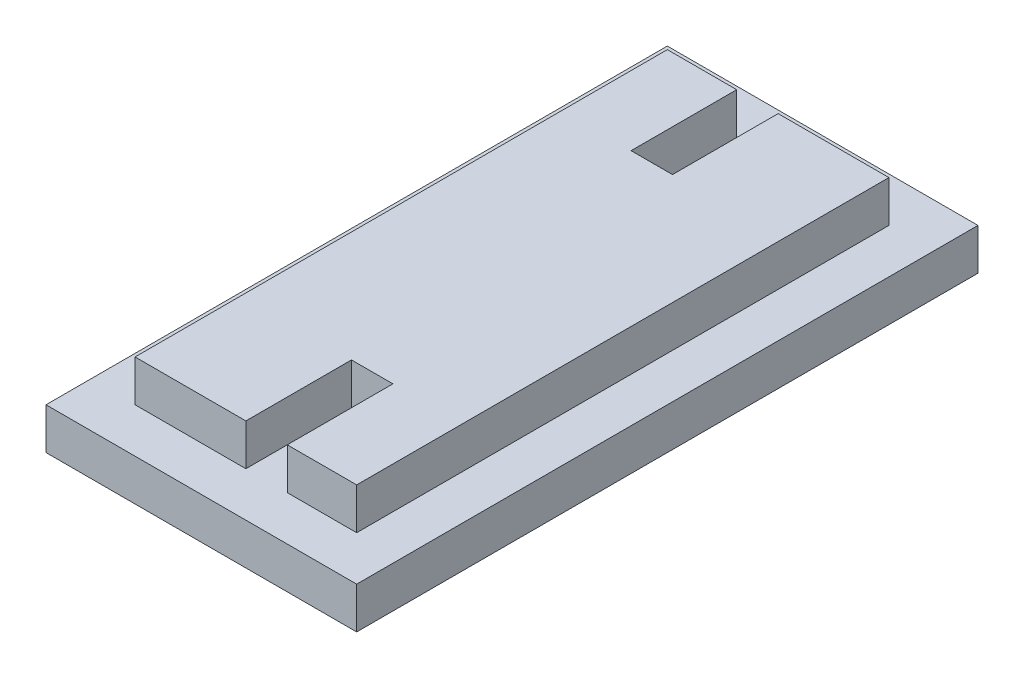
ISO-10303-21;
HEADER;
FILE_DESCRIPTION(('STEP AP214'),'2;1');
FILE_NAME('part.step','',(''),(''),'','','');
FILE_SCHEMA(('AUTOMOTIVE_DESIGN { 1 0 10303 214 1 1 1 1 }'));
ENDSEC;
DATA;
#1=APPLICATION_CONTEXT('core data for automotive mechanical design processes');
#2=APPLICATION_PROTOCOL_DEFINITION('international standard','automotive_design',2000,#1);
#3=PRODUCT_CONTEXT('',#1,'mechanical');
#4=PRODUCT('Part','Part','',(#3));
#5=PRODUCT_RELATED_PRODUCT_CATEGORY('part','',(#4));
#6=PRODUCT_DEFINITION_FORMATION('','',#4);
#7=PRODUCT_DEFINITION_CONTEXT('part definition',#1,'design');
#8=PRODUCT_DEFINITION('design','',#6,#7);
#9=PRODUCT_DEFINITION_SHAPE('','',#8);
#10=(LENGTH_UNIT() NAMED_UNIT(*) SI_UNIT(.MILLI.,.METRE.));
#11=(NAMED_UNIT(*) PLANE_ANGLE_UNIT() SI_UNIT($,.RADIAN.));
#12=(NAMED_UNIT(*) SI_UNIT($,.STERADIAN.) SOLID_ANGLE_UNIT());
#13=UNCERTAINTY_MEASURE_WITH_UNIT(LENGTH_MEASURE(1.E-05),#10,'distance_accuracy_value','');
#14=(GEOMETRIC_REPRESENTATION_CONTEXT(3) GLOBAL_UNCERTAINTY_ASSIGNED_CONTEXT((#13)) GLOBAL_UNIT_ASSIGNED_CONTEXT((#10,
#11,#12)) REPRESENTATION_CONTEXT('',''));
#15=CARTESIAN_POINT('',(0.,0.,0.));
#16=DIRECTION('',(0.,0.,1.));
#17=DIRECTION('',(1.,0.,0.));
#18=AXIS2_PLACEMENT_3D('',#15,#16,#17);
#19=CARTESIAN_POINT('',(2.15,4.,-2.15));
#20=DIRECTION('',(0.,0.,-1.));
#21=DIRECTION('',(-1.,0.,0.));
#22=AXIS2_PLACEMENT_3D('',#19,#20,#21);
#23=PLANE('',#22);
#24=DIRECTION('',(1.,0.,0.));
#25=VECTOR('',#24,1.);
#26=CARTESIAN_POINT('',(2.15,2.,-2.15));
#27=LINE('',#26,#25);
#28=CARTESIAN_POINT('',(2.15,2.,-2.15));
#29=VERTEX_POINT('',#28);
#30=CARTESIAN_POINT('',(7.5,2.,-2.15));
#31=VERTEX_POINT('',#30);
#32=EDGE_CURVE('E165',#29,#31,#27,.T.);
#33=ORIENTED_EDGE('',*,*,#32,.T.);
#34=DIRECTION('',(0.,1.,0.));
#35=VECTOR('',#34,1.);
#36=CARTESIAN_POINT('',(7.5,2.,-2.15));
#37=LINE('',#36,#35);
#38=CARTESIAN_POINT('',(7.5,4.,-2.15));
#39=VERTEX_POINT('',#38);
#40=EDGE_CURVE('E150',#31,#39,#37,.T.);
#41=ORIENTED_EDGE('',*,*,#40,.T.);
#42=DIRECTION('',(1.,0.,0.));
#43=VECTOR('',#42,1.);
#44=CARTESIAN_POINT('',(2.15,4.,-2.15));
#45=LINE('',#44,#43);
#46=CARTESIAN_POINT('',(2.15,4.,-2.15));
#47=VERTEX_POINT('',#46);
#48=EDGE_CURVE('E278',#47,#39,#45,.T.);
#49=ORIENTED_EDGE('',*,*,#48,.F.);
#50=DIRECTION('',(0.,-1.,0.));
#51=VECTOR('',#50,1.);
#52=CARTESIAN_POINT('',(2.15,4.,-2.15));
#53=LINE('',#52,#51);
#54=EDGE_CURVE('E173',#47,#29,#53,.T.);
#55=ORIENTED_EDGE('',*,*,#54,.T.);
#56=EDGE_LOOP('',(#33,#41,#49,#55));
#57=FACE_BOUND('',#56,.T.);
#58=ADVANCED_FACE('F35',(#57),#23,.F.);
#59=CARTESIAN_POINT('',(2.15,4.,-27.85));
#60=DIRECTION('',(0.,0.,1.));
#61=DIRECTION('',(1.,0.,0.));
#62=AXIS2_PLACEMENT_3D('',#59,#60,#61);
#63=PLANE('',#62);
#64=DIRECTION('',(-1.,0.,0.));
#65=VECTOR('',#64,1.);
#66=CARTESIAN_POINT('',(2.15,2.,-27.85));
#67=LINE('',#66,#65);
#68=CARTESIAN_POINT('',(12.85,2.,-27.85));
#69=VERTEX_POINT('',#68);
#70=CARTESIAN_POINT('',(7.5,2.,-27.85));
#71=VERTEX_POINT('',#70);
#72=EDGE_CURVE('E185',#69,#71,#67,.T.);
#73=ORIENTED_EDGE('',*,*,#72,.T.);
#74=DIRECTION('',(0.,1.,0.));
#75=VECTOR('',#74,1.);
#76=CARTESIAN_POINT('',(7.5,2.,-27.85));
#77=LINE('',#76,#75);
#78=CARTESIAN_POINT('',(7.5,4.,-27.85));
#79=VERTEX_POINT('',#78);
#80=EDGE_CURVE('E308',#71,#79,#77,.T.);
#81=ORIENTED_EDGE('',*,*,#80,.T.);
#82=DIRECTION('',(-1.,0.,0.));
#83=VECTOR('',#82,1.);
#84=CARTESIAN_POINT('',(2.15,4.,-27.85));
#85=LINE('',#84,#83);
#86=CARTESIAN_POINT('',(12.85,4.,-27.85));
#87=VERTEX_POINT('',#86);
#88=EDGE_CURVE('E193',#87,#79,#85,.T.);
#89=ORIENTED_EDGE('',*,*,#88,.F.);
#90=DIRECTION('',(0.,-1.,0.));
#91=VECTOR('',#90,1.);
#92=CARTESIAN_POINT('',(12.85,4.,-27.85));
#93=LINE('',#92,#91);
#94=EDGE_CURVE('E192',#87,#69,#93,.T.);
#95=ORIENTED_EDGE('',*,*,#94,.T.);
#96=EDGE_LOOP('',(#73,#81,#89,#95));
#97=FACE_BOUND('',#96,.T.);
#98=ADVANCED_FACE('F251',(#97),#63,.F.);
#99=CARTESIAN_POINT('',(0.,2.,0.));
#100=DIRECTION('',(0.,-1.,0.));
#101=DIRECTION('',(0.,0.,-1.));
#102=AXIS2_PLACEMENT_3D('',#99,#100,#101);
#103=PLANE('',#102);
#104=DIRECTION('',(0.,0.,1.));
#105=VECTOR('',#104,1.);
#106=CARTESIAN_POINT('',(0.,2.,0.));
#107=LINE('',#106,#105);
#108=CARTESIAN_POINT('',(0.,2.,-30.));
#109=VERTEX_POINT('',#108);
#110=CARTESIAN_POINT('',(0.,2.,0.));
#111=VERTEX_POINT('',#110);
#112=EDGE_CURVE('E201',#109,#111,#107,.T.);
#113=ORIENTED_EDGE('',*,*,#112,.T.);
#114=DIRECTION('',(1.,0.,0.));
#115=VECTOR('',#114,1.);
#116=CARTESIAN_POINT('',(0.,2.,0.));
#117=LINE('',#116,#115);
#118=CARTESIAN_POINT('',(15.,2.,0.));
#119=VERTEX_POINT('',#118);
#120=EDGE_CURVE('E204',#111,#119,#117,.T.);
#121=ORIENTED_EDGE('',*,*,#120,.T.);
#122=DIRECTION('',(0.,0.,-1.));
#123=VECTOR('',#122,1.);
#124=CARTESIAN_POINT('',(15.,2.,0.));
#125=LINE('',#124,#123);
#126=CARTESIAN_POINT('',(15.,2.,-30.));
#127=VERTEX_POINT('',#126);
#128=EDGE_CURVE('E207',#119,#127,#125,.T.);
#129=ORIENTED_EDGE('',*,*,#128,.T.);
#130=DIRECTION('',(-1.,0.,0.));
#131=VECTOR('',#130,1.);
#132=CARTESIAN_POINT('',(0.,2.,-30.));
#133=LINE('',#132,#131);
#134=EDGE_CURVE('E209',#127,#109,#133,.T.);
#135=ORIENTED_EDGE('',*,*,#134,.T.);
#136=EDGE_LOOP('',(#113,#121,#129,#135));
#137=FACE_BOUND('',#136,.T.);
#138=DIRECTION('',(0.,0.,1.));
#139=VECTOR('',#138,1.);
#140=CARTESIAN_POINT('',(2.15,2.,-27.85));
#141=LINE('',#140,#139);
#142=CARTESIAN_POINT('',(2.15,2.,-27.85));
#143=VERTEX_POINT('',#142);
#144=EDGE_CURVE('E181',#143,#29,#141,.T.);
#145=ORIENTED_EDGE('',*,*,#144,.F.);
#146=CARTESIAN_POINT('',(5.5,2.,-27.85));
#147=VERTEX_POINT('',#146);
#148=EDGE_CURVE('E179',#147,#143,#67,.T.);
#149=ORIENTED_EDGE('',*,*,#148,.F.);
#150=DIRECTION('',(0.,0.,1.));
#151=VECTOR('',#150,1.);
#152=CARTESIAN_POINT('',(5.5,2.,-27.85));
#153=LINE('',#152,#151);
#154=CARTESIAN_POINT('',(5.5,2.,-22.75));
#155=VERTEX_POINT('',#154);
#156=EDGE_CURVE('E312',#147,#155,#153,.T.);
#157=ORIENTED_EDGE('',*,*,#156,.T.);
#158=DIRECTION('',(1.,0.,0.));
#159=VECTOR('',#158,1.);
#160=CARTESIAN_POINT('',(7.5,2.,-22.75));
#161=LINE('',#160,#159);
#162=CARTESIAN_POINT('',(7.5,2.,-22.75));
#163=VERTEX_POINT('',#162);
#164=EDGE_CURVE('E310',#155,#163,#161,.T.);
#165=ORIENTED_EDGE('',*,*,#164,.T.);
#166=DIRECTION('',(0.,0.,-1.));
#167=VECTOR('',#166,1.);
#168=CARTESIAN_POINT('',(7.5,2.,-27.85));
#169=LINE('',#168,#167);
#170=EDGE_CURVE('E317',#163,#71,#169,.T.);
#171=ORIENTED_EDGE('',*,*,#170,.T.);
#172=ORIENTED_EDGE('',*,*,#72,.F.);
#173=DIRECTION('',(0.,0.,-1.));
#174=VECTOR('',#173,1.);
#175=CARTESIAN_POINT('',(12.85,2.,-27.85));
#176=LINE('',#175,#174);
#177=CARTESIAN_POINT('',(12.85,2.,-2.15));
#178=VERTEX_POINT('',#177);
#179=EDGE_CURVE('E175',#178,#69,#176,.T.);
#180=ORIENTED_EDGE('',*,*,#179,.F.);
#181=CARTESIAN_POINT('',(9.5,2.,-2.15));
#182=VERTEX_POINT('',#181);
#183=EDGE_CURVE('E176',#182,#178,#27,.T.);
#184=ORIENTED_EDGE('',*,*,#183,.F.);
#185=DIRECTION('',(0.,0.,-1.));
#186=VECTOR('',#185,1.);
#187=CARTESIAN_POINT('',(9.5,2.,-2.15));
#188=LINE('',#187,#186);
#189=CARTESIAN_POINT('',(9.5,2.,-7.25));
#190=VERTEX_POINT('',#189);
#191=EDGE_CURVE('E169',#182,#190,#188,.T.);
#192=ORIENTED_EDGE('',*,*,#191,.T.);
#193=DIRECTION('',(-1.,0.,0.));
#194=VECTOR('',#193,1.);
#195=CARTESIAN_POINT('',(7.5,2.,-7.25));
#196=LINE('',#195,#194);
#197=CARTESIAN_POINT('',(7.5,2.,-7.25));
#198=VERTEX_POINT('',#197);
#199=EDGE_CURVE('E160',#190,#198,#196,.T.);
#200=ORIENTED_EDGE('',*,*,#199,.T.);
#201=DIRECTION('',(0.,0.,1.));
#202=VECTOR('',#201,1.);
#203=CARTESIAN_POINT('',(7.5,2.,-2.15));
#204=LINE('',#203,#202);
#205=EDGE_CURVE('E153',#198,#31,#204,.T.);
#206=ORIENTED_EDGE('',*,*,#205,.T.);
#207=ORIENTED_EDGE('',*,*,#32,.F.);
#208=EDGE_LOOP('',(#145,#149,#157,#165,#171,#172,#180,#184,#192,#200,#206,#207));
#209=FACE_BOUND('',#208,.T.);
#210=ADVANCED_FACE('F164',(#137,#209),#103,.F.);
#211=CARTESIAN_POINT('',(0.,2.,0.));
#212=DIRECTION('',(1.,0.,0.));
#213=DIRECTION('',(0.,0.,-1.));
#214=AXIS2_PLACEMENT_3D('',#211,#212,#213);
#215=PLANE('',#214);
#216=DIRECTION('',(0.,0.,1.));
#217=VECTOR('',#216,1.);
#218=CARTESIAN_POINT('',(0.,0.,0.));
#219=LINE('',#218,#217);
#220=CARTESIAN_POINT('',(0.,0.,-30.));
#221=VERTEX_POINT('',#220);
#222=CARTESIAN_POINT('',(0.,0.,0.));
#223=VERTEX_POINT('',#222);
#224=EDGE_CURVE('E200',#221,#223,#219,.T.);
#225=ORIENTED_EDGE('',*,*,#224,.T.);
#226=DIRECTION('',(0.,-1.,0.));
#227=VECTOR('',#226,1.);
#228=CARTESIAN_POINT('',(0.,2.,0.));
#229=LINE('',#228,#227);
#230=EDGE_CURVE('E11',#111,#223,#229,.T.);
#231=ORIENTED_EDGE('',*,*,#230,.F.);
#232=ORIENTED_EDGE('',*,*,#112,.F.);
#233=DIRECTION('',(0.,-1.,0.));
#234=VECTOR('',#233,1.);
#235=CARTESIAN_POINT('',(0.,2.,-30.));
#236=LINE('',#235,#234);
#237=EDGE_CURVE('E211',#109,#221,#236,.T.);
#238=ORIENTED_EDGE('',*,*,#237,.T.);
#239=EDGE_LOOP('',(#225,#231,#232,#238));
#240=FACE_BOUND('',#239,.T.);
#241=ADVANCED_FACE('F37',(#240),#215,.F.);
#242=CARTESIAN_POINT('',(0.,2.,0.));
#243=DIRECTION('',(0.,0.,-1.));
#244=DIRECTION('',(-1.,0.,0.));
#245=AXIS2_PLACEMENT_3D('',#242,#243,#244);
#246=PLANE('',#245);
#247=DIRECTION('',(1.,0.,0.));
#248=VECTOR('',#247,1.);
#249=CARTESIAN_POINT('',(0.,0.,0.));
#250=LINE('',#249,#248);
#251=CARTESIAN_POINT('',(15.,0.,0.));
#252=VERTEX_POINT('',#251);
#253=EDGE_CURVE('E214',#223,#252,#250,.T.);
#254=ORIENTED_EDGE('',*,*,#253,.T.);
#255=DIRECTION('',(0.,-1.,0.));
#256=VECTOR('',#255,1.);
#257=CARTESIAN_POINT('',(15.,2.,0.));
#258=LINE('',#257,#256);
#259=EDGE_CURVE('E43',#119,#252,#258,.T.);
#260=ORIENTED_EDGE('',*,*,#259,.F.);
#261=ORIENTED_EDGE('',*,*,#120,.F.);
#262=ORIENTED_EDGE('',*,*,#230,.T.);
#263=EDGE_LOOP('',(#254,#260,#261,#262));
#264=FACE_BOUND('',#263,.T.);
#265=ADVANCED_FACE('F243',(#264),#246,.F.);
#266=CARTESIAN_POINT('',(15.,2.,0.));
#267=DIRECTION('',(-1.,0.,0.));
#268=DIRECTION('',(0.,0.,1.));
#269=AXIS2_PLACEMENT_3D('',#266,#267,#268);
#270=PLANE('',#269);
#271=DIRECTION('',(0.,0.,-1.));
#272=VECTOR('',#271,1.);
#273=CARTESIAN_POINT('',(15.,0.,0.));
#274=LINE('',#273,#272);
#275=CARTESIAN_POINT('',(15.,0.,-30.));
#276=VERTEX_POINT('',#275);
#277=EDGE_CURVE('E216',#252,#276,#274,.T.);
#278=ORIENTED_EDGE('',*,*,#277,.T.);
#279=DIRECTION('',(0.,-1.,0.));
#280=VECTOR('',#279,1.);
#281=CARTESIAN_POINT('',(15.,2.,-30.));
#282=LINE('',#281,#280);
#283=EDGE_CURVE('E221',#127,#276,#282,.T.);
#284=ORIENTED_EDGE('',*,*,#283,.F.);
#285=ORIENTED_EDGE('',*,*,#128,.F.);
#286=ORIENTED_EDGE('',*,*,#259,.T.);
#287=EDGE_LOOP('',(#278,#284,#285,#286));
#288=FACE_BOUND('',#287,.T.);
#289=ADVANCED_FACE('F228',(#288),#270,.F.);
#290=CARTESIAN_POINT('',(0.,2.,-30.));
#291=DIRECTION('',(0.,0.,1.));
#292=DIRECTION('',(1.,0.,0.));
#293=AXIS2_PLACEMENT_3D('',#290,#291,#292);
#294=PLANE('',#293);
#295=DIRECTION('',(-1.,0.,0.));
#296=VECTOR('',#295,1.);
#297=CARTESIAN_POINT('',(0.,0.,-30.));
#298=LINE('',#297,#296);
#299=EDGE_CURVE('E205',#276,#221,#298,.T.);
#300=ORIENTED_EDGE('',*,*,#299,.T.);
#301=ORIENTED_EDGE('',*,*,#237,.F.);
#302=ORIENTED_EDGE('',*,*,#134,.F.);
#303=ORIENTED_EDGE('',*,*,#283,.T.);
#304=EDGE_LOOP('',(#300,#301,#302,#303));
#305=FACE_BOUND('',#304,.T.);
#306=ADVANCED_FACE('F237',(#305),#294,.F.);
#307=CARTESIAN_POINT('',(0.,0.,0.));
#308=DIRECTION('',(0.,-1.,0.));
#309=DIRECTION('',(0.,0.,-1.));
#310=AXIS2_PLACEMENT_3D('',#307,#308,#309);
#311=PLANE('',#310);
#312=ORIENTED_EDGE('',*,*,#224,.F.);
#313=ORIENTED_EDGE('',*,*,#299,.F.);
#314=ORIENTED_EDGE('',*,*,#277,.F.);
#315=ORIENTED_EDGE('',*,*,#253,.F.);
#316=EDGE_LOOP('',(#312,#313,#314,#315));
#317=FACE_BOUND('',#316,.T.);
#318=ADVANCED_FACE('F234',(#317),#311,.T.);
#319=CARTESIAN_POINT('',(2.15,4.,-27.85));
#320=DIRECTION('',(1.,0.,0.));
#321=DIRECTION('',(0.,0.,-1.));
#322=AXIS2_PLACEMENT_3D('',#319,#320,#321);
#323=PLANE('',#322);
#324=ORIENTED_EDGE('',*,*,#144,.T.);
#325=ORIENTED_EDGE('',*,*,#54,.F.);
#326=DIRECTION('',(0.,0.,1.));
#327=VECTOR('',#326,1.);
#328=CARTESIAN_POINT('',(2.15,4.,-27.85));
#329=LINE('',#328,#327);
#330=CARTESIAN_POINT('',(2.15,4.,-27.85));
#331=VERTEX_POINT('',#330);
#332=EDGE_CURVE('E188',#331,#47,#329,.T.);
#333=ORIENTED_EDGE('',*,*,#332,.F.);
#334=DIRECTION('',(0.,-1.,0.));
#335=VECTOR('',#334,1.);
#336=CARTESIAN_POINT('',(2.15,4.,-27.85));
#337=LINE('',#336,#335);
#338=EDGE_CURVE('E189',#331,#143,#337,.T.);
#339=ORIENTED_EDGE('',*,*,#338,.T.);
#340=EDGE_LOOP('',(#324,#325,#333,#339));
#341=FACE_BOUND('',#340,.T.);
#342=ADVANCED_FACE('F264',(#341),#323,.F.);
#343=CARTESIAN_POINT('',(9.5,4.,-2.15));
#344=VERTEX_POINT('',#343);
#345=CARTESIAN_POINT('',(12.85,4.,-2.15));
#346=VERTEX_POINT('',#345);
#347=EDGE_CURVE('E274',#344,#346,#45,.T.);
#348=ORIENTED_EDGE('',*,*,#347,.F.);
#349=DIRECTION('',(0.,1.,0.));
#350=VECTOR('',#349,1.);
#351=CARTESIAN_POINT('',(9.5,2.,-2.15));
#352=LINE('',#351,#350);
#353=EDGE_CURVE('E50',#182,#344,#352,.T.);
#354=ORIENTED_EDGE('',*,*,#353,.F.);
#355=ORIENTED_EDGE('',*,*,#183,.T.);
#356=DIRECTION('',(0.,-1.,0.));
#357=VECTOR('',#356,1.);
#358=CARTESIAN_POINT('',(12.85,4.,-2.15));
#359=LINE('',#358,#357);
#360=EDGE_CURVE('E196',#346,#178,#359,.T.);
#361=ORIENTED_EDGE('',*,*,#360,.F.);
#362=EDGE_LOOP('',(#348,#354,#355,#361));
#363=FACE_BOUND('',#362,.T.);
#364=ADVANCED_FACE('F253',(#363),#23,.F.);
#365=CARTESIAN_POINT('',(12.85,4.,-27.85));
#366=DIRECTION('',(-1.,0.,0.));
#367=DIRECTION('',(0.,0.,1.));
#368=AXIS2_PLACEMENT_3D('',#365,#366,#367);
#369=PLANE('',#368);
#370=ORIENTED_EDGE('',*,*,#179,.T.);
#371=ORIENTED_EDGE('',*,*,#94,.F.);
#372=DIRECTION('',(0.,0.,-1.));
#373=VECTOR('',#372,1.);
#374=CARTESIAN_POINT('',(12.85,4.,-27.85));
#375=LINE('',#374,#373);
#376=EDGE_CURVE('E280',#346,#87,#375,.T.);
#377=ORIENTED_EDGE('',*,*,#376,.F.);
#378=ORIENTED_EDGE('',*,*,#360,.T.);
#379=EDGE_LOOP('',(#370,#371,#377,#378));
#380=FACE_BOUND('',#379,.T.);
#381=ADVANCED_FACE('F263',(#380),#369,.F.);
#382=CARTESIAN_POINT('',(5.5,4.,-27.85));
#383=VERTEX_POINT('',#382);
#384=EDGE_CURVE('E285',#383,#331,#85,.T.);
#385=ORIENTED_EDGE('',*,*,#384,.F.);
#386=DIRECTION('',(0.,1.,0.));
#387=VECTOR('',#386,1.);
#388=CARTESIAN_POINT('',(5.5,2.,-27.85));
#389=LINE('',#388,#387);
#390=EDGE_CURVE('E58',#147,#383,#389,.T.);
#391=ORIENTED_EDGE('',*,*,#390,.F.);
#392=ORIENTED_EDGE('',*,*,#148,.T.);
#393=ORIENTED_EDGE('',*,*,#338,.F.);
#394=EDGE_LOOP('',(#385,#391,#392,#393));
#395=FACE_BOUND('',#394,.T.);
#396=ADVANCED_FACE('F259',(#395),#63,.F.);
#397=CARTESIAN_POINT('',(0.,4.,0.));
#398=DIRECTION('',(0.,1.,0.));
#399=DIRECTION('',(0.,0.,1.));
#400=AXIS2_PLACEMENT_3D('',#397,#398,#399);
#401=PLANE('',#400);
#402=DIRECTION('',(0.,0.,1.));
#403=VECTOR('',#402,1.);
#404=CARTESIAN_POINT('',(7.5,4.,-2.15));
#405=LINE('',#404,#403);
#406=CARTESIAN_POINT('',(7.5,4.,-7.25));
#407=VERTEX_POINT('',#406);
#408=EDGE_CURVE('E156',#407,#39,#405,.T.);
#409=ORIENTED_EDGE('',*,*,#408,.F.);
#410=DIRECTION('',(-1.,0.,0.));
#411=VECTOR('',#410,1.);
#412=CARTESIAN_POINT('',(7.5,4.,-7.25));
#413=LINE('',#412,#411);
#414=CARTESIAN_POINT('',(9.5,4.,-7.25));
#415=VERTEX_POINT('',#414);
#416=EDGE_CURVE('E170',#415,#407,#413,.T.);
#417=ORIENTED_EDGE('',*,*,#416,.F.);
#418=DIRECTION('',(0.,0.,-1.));
#419=VECTOR('',#418,1.);
#420=CARTESIAN_POINT('',(9.5,4.,-2.15));
#421=LINE('',#420,#419);
#422=EDGE_CURVE('E331',#344,#415,#421,.T.);
#423=ORIENTED_EDGE('',*,*,#422,.F.);
#424=ORIENTED_EDGE('',*,*,#347,.T.);
#425=ORIENTED_EDGE('',*,*,#376,.T.);
#426=ORIENTED_EDGE('',*,*,#88,.T.);
#427=DIRECTION('',(0.,0.,-1.));
#428=VECTOR('',#427,1.);
#429=CARTESIAN_POINT('',(7.5,4.,-27.85));
#430=LINE('',#429,#428);
#431=CARTESIAN_POINT('',(7.5,4.,-22.75));
#432=VERTEX_POINT('',#431);
#433=EDGE_CURVE('E321',#432,#79,#430,.T.);
#434=ORIENTED_EDGE('',*,*,#433,.F.);
#435=DIRECTION('',(1.,0.,0.));
#436=VECTOR('',#435,1.);
#437=CARTESIAN_POINT('',(7.5,4.,-22.75));
#438=LINE('',#437,#436);
#439=CARTESIAN_POINT('',(5.5,4.,-22.75));
#440=VERTEX_POINT('',#439);
#441=EDGE_CURVE('E305',#440,#432,#438,.T.);
#442=ORIENTED_EDGE('',*,*,#441,.F.);
#443=DIRECTION('',(0.,0.,1.));
#444=VECTOR('',#443,1.);
#445=CARTESIAN_POINT('',(5.5,4.,-27.85));
#446=LINE('',#445,#444);
#447=EDGE_CURVE('E294',#383,#440,#446,.T.);
#448=ORIENTED_EDGE('',*,*,#447,.F.);
#449=ORIENTED_EDGE('',*,*,#384,.T.);
#450=ORIENTED_EDGE('',*,*,#332,.T.);
#451=ORIENTED_EDGE('',*,*,#48,.T.);
#452=EDGE_LOOP('',(#409,#417,#423,#424,#425,#426,#434,#442,#448,#449,#450,#451));
#453=FACE_BOUND('',#452,.T.);
#454=ADVANCED_FACE('F291',(#453),#401,.T.);
#455=CARTESIAN_POINT('',(7.5,2.,-27.85));
#456=DIRECTION('',(1.,0.,0.));
#457=DIRECTION('',(0.,0.,-1.));
#458=AXIS2_PLACEMENT_3D('',#455,#456,#457);
#459=PLANE('',#458);
#460=ORIENTED_EDGE('',*,*,#433,.T.);
#461=ORIENTED_EDGE('',*,*,#80,.F.);
#462=ORIENTED_EDGE('',*,*,#170,.F.);
#463=DIRECTION('',(0.,1.,0.));
#464=VECTOR('',#463,1.);
#465=CARTESIAN_POINT('',(7.5,2.,-22.75));
#466=LINE('',#465,#464);
#467=EDGE_CURVE('E297',#163,#432,#466,.T.);
#468=ORIENTED_EDGE('',*,*,#467,.T.);
#469=EDGE_LOOP('',(#460,#461,#462,#468));
#470=FACE_BOUND('',#469,.T.);
#471=ADVANCED_FACE('F353',(#470),#459,.F.);
#472=CARTESIAN_POINT('',(7.5,2.,-22.75));
#473=DIRECTION('',(0.,0.,1.));
#474=DIRECTION('',(1.,0.,0.));
#475=AXIS2_PLACEMENT_3D('',#472,#473,#474);
#476=PLANE('',#475);
#477=ORIENTED_EDGE('',*,*,#441,.T.);
#478=ORIENTED_EDGE('',*,*,#467,.F.);
#479=ORIENTED_EDGE('',*,*,#164,.F.);
#480=DIRECTION('',(0.,1.,0.));
#481=VECTOR('',#480,1.);
#482=CARTESIAN_POINT('',(5.5,2.,-22.75));
#483=LINE('',#482,#481);
#484=EDGE_CURVE('E298',#155,#440,#483,.T.);
#485=ORIENTED_EDGE('',*,*,#484,.T.);
#486=EDGE_LOOP('',(#477,#478,#479,#485));
#487=FACE_BOUND('',#486,.T.);
#488=ADVANCED_FACE('F350',(#487),#476,.F.);
#489=CARTESIAN_POINT('',(5.5,2.,-27.85));
#490=DIRECTION('',(-1.,0.,0.));
#491=DIRECTION('',(0.,0.,1.));
#492=AXIS2_PLACEMENT_3D('',#489,#490,#491);
#493=PLANE('',#492);
#494=ORIENTED_EDGE('',*,*,#447,.T.);
#495=ORIENTED_EDGE('',*,*,#484,.F.);
#496=ORIENTED_EDGE('',*,*,#156,.F.);
#497=ORIENTED_EDGE('',*,*,#390,.T.);
#498=EDGE_LOOP('',(#494,#495,#496,#497));
#499=FACE_BOUND('',#498,.T.);
#500=ADVANCED_FACE('F349',(#499),#493,.F.);
#501=CARTESIAN_POINT('',(7.5,2.,-2.15));
#502=DIRECTION('',(-1.,0.,0.));
#503=DIRECTION('',(0.,0.,1.));
#504=AXIS2_PLACEMENT_3D('',#501,#502,#503);
#505=PLANE('',#504);
#506=ORIENTED_EDGE('',*,*,#408,.T.);
#507=ORIENTED_EDGE('',*,*,#40,.F.);
#508=ORIENTED_EDGE('',*,*,#205,.F.);
#509=DIRECTION('',(0.,1.,0.));
#510=VECTOR('',#509,1.);
#511=CARTESIAN_POINT('',(7.5,2.,-7.25));
#512=LINE('',#511,#510);
#513=EDGE_CURVE('E322',#198,#407,#512,.T.);
#514=ORIENTED_EDGE('',*,*,#513,.T.);
#515=EDGE_LOOP('',(#506,#507,#508,#514));
#516=FACE_BOUND('',#515,.T.);
#517=ADVANCED_FACE('F152',(#516),#505,.F.);
#518=CARTESIAN_POINT('',(7.5,2.,-7.25));
#519=DIRECTION('',(0.,0.,-1.));
#520=DIRECTION('',(-1.,0.,0.));
#521=AXIS2_PLACEMENT_3D('',#518,#519,#520);
#522=PLANE('',#521);
#523=ORIENTED_EDGE('',*,*,#416,.T.);
#524=ORIENTED_EDGE('',*,*,#513,.F.);
#525=ORIENTED_EDGE('',*,*,#199,.F.);
#526=DIRECTION('',(0.,1.,0.));
#527=VECTOR('',#526,1.);
#528=CARTESIAN_POINT('',(9.5,2.,-7.25));
#529=LINE('',#528,#527);
#530=EDGE_CURVE('E326',#190,#415,#529,.T.);
#531=ORIENTED_EDGE('',*,*,#530,.T.);
#532=EDGE_LOOP('',(#523,#524,#525,#531));
#533=FACE_BOUND('',#532,.T.);
#534=ADVANCED_FACE('F337',(#533),#522,.F.);
#535=CARTESIAN_POINT('',(9.5,2.,-2.15));
#536=DIRECTION('',(1.,0.,0.));
#537=DIRECTION('',(0.,0.,-1.));
#538=AXIS2_PLACEMENT_3D('',#535,#536,#537);
#539=PLANE('',#538);
#540=ORIENTED_EDGE('',*,*,#422,.T.);
#541=ORIENTED_EDGE('',*,*,#530,.F.);
#542=ORIENTED_EDGE('',*,*,#191,.F.);
#543=ORIENTED_EDGE('',*,*,#353,.T.);
#544=EDGE_LOOP('',(#540,#541,#542,#543));
#545=FACE_BOUND('',#544,.T.);
#546=ADVANCED_FACE('F339',(#545),#539,.F.);
#547=CLOSED_SHELL('',(#58,#98,#210,#241,#265,#289,#306,#318,#342,#364,#381,#396,#454,#471,#488,
#500,#517,#534,#546));
#548=MANIFOLD_SOLID_BREP('B2',#547);
#549=ADVANCED_BREP_SHAPE_REPRESENTATION('',(#18,#548),#14);
#550=SHAPE_DEFINITION_REPRESENTATION(#9,#549);
ENDSEC;
END-ISO-10303-21;
